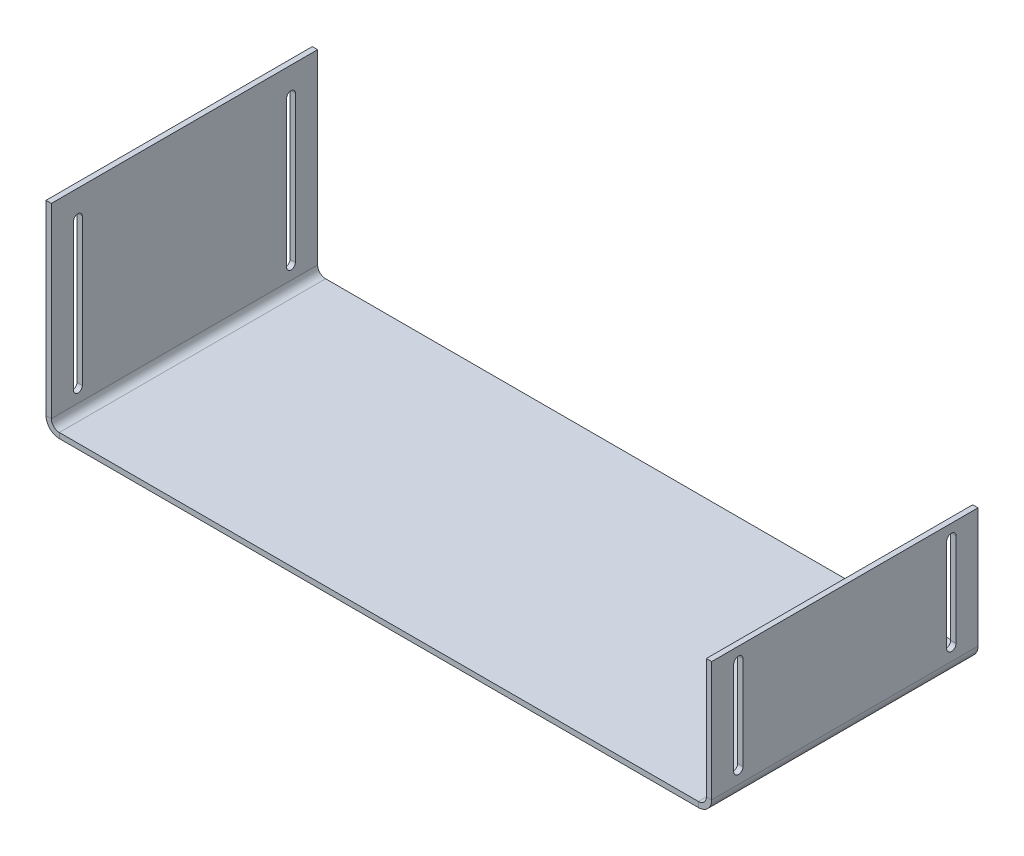
ISO-10303-21;
HEADER;
FILE_DESCRIPTION(('STEP AP214'),'2;1');
FILE_NAME('part.step','',(''),(''),'','','');
FILE_SCHEMA(('AUTOMOTIVE_DESIGN { 1 0 10303 214 1 1 1 1 }'));
ENDSEC;
DATA;
#1=APPLICATION_CONTEXT('core data for automotive mechanical design processes');
#2=APPLICATION_PROTOCOL_DEFINITION('international standard','automotive_design',2000,#1);
#3=PRODUCT_CONTEXT('',#1,'mechanical');
#4=PRODUCT('Part','Part','',(#3));
#5=PRODUCT_RELATED_PRODUCT_CATEGORY('part','',(#4));
#6=PRODUCT_DEFINITION_FORMATION('','',#4);
#7=PRODUCT_DEFINITION_CONTEXT('part definition',#1,'design');
#8=PRODUCT_DEFINITION('design','',#6,#7);
#9=PRODUCT_DEFINITION_SHAPE('','',#8);
#10=(LENGTH_UNIT() NAMED_UNIT(*) SI_UNIT(.MILLI.,.METRE.));
#11=(NAMED_UNIT(*) PLANE_ANGLE_UNIT() SI_UNIT($,.RADIAN.));
#12=(NAMED_UNIT(*) SI_UNIT($,.STERADIAN.) SOLID_ANGLE_UNIT());
#13=UNCERTAINTY_MEASURE_WITH_UNIT(LENGTH_MEASURE(1.E-05),#10,'distance_accuracy_value','');
#14=(GEOMETRIC_REPRESENTATION_CONTEXT(3) GLOBAL_UNCERTAINTY_ASSIGNED_CONTEXT((#13)) GLOBAL_UNIT_ASSIGNED_CONTEXT((#10,
#11,#12)) REPRESENTATION_CONTEXT('',''));
#15=CARTESIAN_POINT('',(0.,0.,0.));
#16=DIRECTION('',(0.,0.,1.));
#17=DIRECTION('',(1.,0.,0.));
#18=AXIS2_PLACEMENT_3D('',#15,#16,#17);
#19=CARTESIAN_POINT('',(0.,-4.,0.));
#20=DIRECTION('',(0.,-1.,0.));
#21=DIRECTION('',(0.,0.,-1.));
#22=AXIS2_PLACEMENT_3D('',#19,#20,#21);
#23=PLANE('',#22);
#24=DIRECTION('',(1.,0.,0.));
#25=VECTOR('',#24,1.);
#26=CARTESIAN_POINT('',(-250.,-4.,100.));
#27=LINE('',#26,#25);
#28=CARTESIAN_POINT('',(-240.,-4.,100.));
#29=VERTEX_POINT('',#28);
#30=CARTESIAN_POINT('',(240.,-4.,100.));
#31=VERTEX_POINT('',#30);
#32=EDGE_CURVE('E11',#29,#31,#27,.T.);
#33=ORIENTED_EDGE('',*,*,#32,.F.);
#34=DIRECTION('',(0.,0.,1.));
#35=VECTOR('',#34,1.);
#36=CARTESIAN_POINT('',(-240.,-4.,100.));
#37=LINE('',#36,#35);
#38=CARTESIAN_POINT('',(-240.,-4.,-100.));
#39=VERTEX_POINT('',#38);
#40=EDGE_CURVE('E358',#29,#39,#37,.F.);
#41=ORIENTED_EDGE('',*,*,#40,.T.);
#42=DIRECTION('',(-1.,0.,0.));
#43=VECTOR('',#42,1.);
#44=CARTESIAN_POINT('',(-250.,-4.,-100.));
#45=LINE('',#44,#43);
#46=CARTESIAN_POINT('',(240.,-4.,-100.));
#47=VERTEX_POINT('',#46);
#48=EDGE_CURVE('E26',#47,#39,#45,.T.);
#49=ORIENTED_EDGE('',*,*,#48,.F.);
#50=DIRECTION('',(0.,0.,-1.));
#51=VECTOR('',#50,1.);
#52=CARTESIAN_POINT('',(240.,-4.,-100.));
#53=LINE('',#52,#51);
#54=EDGE_CURVE('E413',#47,#31,#53,.F.);
#55=ORIENTED_EDGE('',*,*,#54,.T.);
#56=EDGE_LOOP('',(#33,#41,#49,#55));
#57=FACE_BOUND('',#56,.T.);
#58=ADVANCED_FACE('F17',(#57),#23,.T.);
#59=CARTESIAN_POINT('',(0.,0.,0.));
#60=DIRECTION('',(0.,-1.,0.));
#61=DIRECTION('',(0.,0.,-1.));
#62=AXIS2_PLACEMENT_3D('',#59,#60,#61);
#63=PLANE('',#62);
#64=DIRECTION('',(0.,0.,1.));
#65=VECTOR('',#64,1.);
#66=CARTESIAN_POINT('',(-240.,0.,100.));
#67=LINE('',#66,#65);
#68=CARTESIAN_POINT('',(-240.,0.,100.));
#69=VERTEX_POINT('',#68);
#70=CARTESIAN_POINT('',(-240.,0.,-100.));
#71=VERTEX_POINT('',#70);
#72=EDGE_CURVE('E371',#69,#71,#67,.F.);
#73=ORIENTED_EDGE('',*,*,#72,.F.);
#74=DIRECTION('',(1.,0.,0.));
#75=VECTOR('',#74,1.);
#76=CARTESIAN_POINT('',(-250.,0.,100.));
#77=LINE('',#76,#75);
#78=CARTESIAN_POINT('',(240.,0.,100.));
#79=VERTEX_POINT('',#78);
#80=EDGE_CURVE('E437',#69,#79,#77,.T.);
#81=ORIENTED_EDGE('',*,*,#80,.T.);
#82=DIRECTION('',(0.,0.,-1.));
#83=VECTOR('',#82,1.);
#84=CARTESIAN_POINT('',(240.,0.,-100.));
#85=LINE('',#84,#83);
#86=CARTESIAN_POINT('',(240.,0.,-100.));
#87=VERTEX_POINT('',#86);
#88=EDGE_CURVE('E426',#87,#79,#85,.F.);
#89=ORIENTED_EDGE('',*,*,#88,.F.);
#90=DIRECTION('',(-1.,0.,0.));
#91=VECTOR('',#90,1.);
#92=CARTESIAN_POINT('',(-250.,0.,-100.));
#93=LINE('',#92,#91);
#94=EDGE_CURVE('E433',#87,#71,#93,.T.);
#95=ORIENTED_EDGE('',*,*,#94,.T.);
#96=EDGE_LOOP('',(#73,#81,#89,#95));
#97=FACE_BOUND('',#96,.T.);
#98=ADVANCED_FACE('F493',(#97),#63,.F.);
#99=CARTESIAN_POINT('',(-250.,-4.,100.));
#100=DIRECTION('',(0.,0.,1.));
#101=DIRECTION('',(1.,0.,0.));
#102=AXIS2_PLACEMENT_3D('',#99,#100,#101);
#103=PLANE('',#102);
#104=ORIENTED_EDGE('',*,*,#80,.F.);
#105=DIRECTION('',(0.,-1.,0.));
#106=VECTOR('',#105,1.);
#107=CARTESIAN_POINT('',(-240.,0.,100.));
#108=LINE('',#107,#106);
#109=EDGE_CURVE('E365',#69,#29,#108,.T.);
#110=ORIENTED_EDGE('',*,*,#109,.T.);
#111=ORIENTED_EDGE('',*,*,#32,.T.);
#112=DIRECTION('',(0.,-1.,0.));
#113=VECTOR('',#112,1.);
#114=CARTESIAN_POINT('',(240.,0.,100.));
#115=LINE('',#114,#113);
#116=EDGE_CURVE('E430',#79,#31,#115,.T.);
#117=ORIENTED_EDGE('',*,*,#116,.F.);
#118=EDGE_LOOP('',(#104,#110,#111,#117));
#119=FACE_BOUND('',#118,.T.);
#120=ADVANCED_FACE('F497',(#119),#103,.T.);
#121=CARTESIAN_POINT('',(-250.,-4.,-100.));
#122=DIRECTION('',(0.,0.,-1.));
#123=DIRECTION('',(-1.,0.,0.));
#124=AXIS2_PLACEMENT_3D('',#121,#122,#123);
#125=PLANE('',#124);
#126=DIRECTION('',(0.,-1.,0.));
#127=VECTOR('',#126,1.);
#128=CARTESIAN_POINT('',(-240.,0.,-100.));
#129=LINE('',#128,#127);
#130=EDGE_CURVE('E377',#71,#39,#129,.T.);
#131=ORIENTED_EDGE('',*,*,#130,.F.);
#132=ORIENTED_EDGE('',*,*,#94,.F.);
#133=DIRECTION('',(0.,-1.,0.));
#134=VECTOR('',#133,1.);
#135=CARTESIAN_POINT('',(240.,0.,-100.));
#136=LINE('',#135,#134);
#137=EDGE_CURVE('E420',#87,#47,#136,.T.);
#138=ORIENTED_EDGE('',*,*,#137,.T.);
#139=ORIENTED_EDGE('',*,*,#48,.T.);
#140=EDGE_LOOP('',(#131,#132,#138,#139));
#141=FACE_BOUND('',#140,.T.);
#142=ADVANCED_FACE('F482',(#141),#125,.T.);
#143=CARTESIAN_POINT('',(240.,6.,100.));
#144=DIRECTION('',(0.,0.,1.));
#145=DIRECTION('',(1.,0.,0.));
#146=AXIS2_PLACEMENT_3D('',#143,#144,#145);
#147=PLANE('',#146);
#148=DIRECTION('',(-1.,0.,0.));
#149=VECTOR('',#148,1.);
#150=CARTESIAN_POINT('',(250.,6.,100.));
#151=LINE('',#150,#149);
#152=CARTESIAN_POINT('',(246.,6.,100.));
#153=VERTEX_POINT('',#152);
#154=CARTESIAN_POINT('',(250.,6.,100.));
#155=VERTEX_POINT('',#154);
#156=EDGE_CURVE('E380',#153,#155,#151,.F.);
#157=ORIENTED_EDGE('',*,*,#156,.F.);
#158=CARTESIAN_POINT('',(240.,6.,100.));
#159=DIRECTION('',(0.,0.,-1.));
#160=DIRECTION('',(-1.,0.,0.));
#161=AXIS2_PLACEMENT_3D('',#158,#159,#160);
#162=CIRCLE('',#161,6.);
#163=EDGE_CURVE('E423',#79,#153,#162,.F.);
#164=ORIENTED_EDGE('',*,*,#163,.F.);
#165=ORIENTED_EDGE('',*,*,#116,.T.);
#166=CARTESIAN_POINT('',(240.,6.,100.));
#167=DIRECTION('',(0.,0.,-1.));
#168=DIRECTION('',(-1.,0.,0.));
#169=AXIS2_PLACEMENT_3D('',#166,#167,#168);
#170=CIRCLE('',#169,10.);
#171=EDGE_CURVE('E416',#31,#155,#170,.F.);
#172=ORIENTED_EDGE('',*,*,#171,.T.);
#173=EDGE_LOOP('',(#157,#164,#165,#172));
#174=FACE_BOUND('',#173,.T.);
#175=ADVANCED_FACE('F499',(#174),#147,.T.);
#176=CARTESIAN_POINT('',(240.,6.,-100.));
#177=DIRECTION('',(0.,0.,1.));
#178=DIRECTION('',(1.,0.,0.));
#179=AXIS2_PLACEMENT_3D('',#176,#177,#178);
#180=PLANE('',#179);
#181=CARTESIAN_POINT('',(240.,6.,-100.));
#182=DIRECTION('',(0.,0.,-1.));
#183=DIRECTION('',(-1.,0.,0.));
#184=AXIS2_PLACEMENT_3D('',#181,#182,#183);
#185=CIRCLE('',#184,6.);
#186=CARTESIAN_POINT('',(246.,6.,-100.));
#187=VERTEX_POINT('',#186);
#188=EDGE_CURVE('E386',#187,#87,#185,.T.);
#189=ORIENTED_EDGE('',*,*,#188,.F.);
#190=DIRECTION('',(-1.,0.,0.));
#191=VECTOR('',#190,1.);
#192=CARTESIAN_POINT('',(246.,6.,-100.));
#193=LINE('',#192,#191);
#194=CARTESIAN_POINT('',(250.,6.,-100.));
#195=VERTEX_POINT('',#194);
#196=EDGE_CURVE('E406',#187,#195,#193,.F.);
#197=ORIENTED_EDGE('',*,*,#196,.T.);
#198=CARTESIAN_POINT('',(240.,6.,-100.));
#199=DIRECTION('',(0.,0.,-1.));
#200=DIRECTION('',(-1.,0.,0.));
#201=AXIS2_PLACEMENT_3D('',#198,#199,#200);
#202=CIRCLE('',#201,10.);
#203=EDGE_CURVE('E417',#195,#47,#202,.T.);
#204=ORIENTED_EDGE('',*,*,#203,.T.);
#205=ORIENTED_EDGE('',*,*,#137,.F.);
#206=EDGE_LOOP('',(#189,#197,#204,#205));
#207=FACE_BOUND('',#206,.T.);
#208=ADVANCED_FACE('F485',(#207),#180,.F.);
#209=CARTESIAN_POINT('',(240.,6.,-100.));
#210=DIRECTION('',(0.,0.,-1.));
#211=DIRECTION('',(1.,0.,0.));
#212=AXIS2_PLACEMENT_3D('',#209,#210,#211);
#213=CYLINDRICAL_SURFACE('',#212,10.);
#214=ORIENTED_EDGE('',*,*,#54,.F.);
#215=ORIENTED_EDGE('',*,*,#203,.F.);
#216=DIRECTION('',(0.,0.,-1.));
#217=VECTOR('',#216,1.);
#218=CARTESIAN_POINT('',(250.,6.,100.));
#219=LINE('',#218,#217);
#220=EDGE_CURVE('E404',#195,#155,#219,.F.);
#221=ORIENTED_EDGE('',*,*,#220,.T.);
#222=ORIENTED_EDGE('',*,*,#171,.F.);
#223=EDGE_LOOP('',(#214,#215,#221,#222));
#224=FACE_BOUND('',#223,.T.);
#225=ADVANCED_FACE('F520',(#224),#213,.T.);
#226=CARTESIAN_POINT('',(240.,6.,-100.));
#227=DIRECTION('',(0.,0.,-1.));
#228=DIRECTION('',(1.,0.,0.));
#229=AXIS2_PLACEMENT_3D('',#226,#227,#228);
#230=CYLINDRICAL_SURFACE('',#229,6.);
#231=ORIENTED_EDGE('',*,*,#88,.T.);
#232=ORIENTED_EDGE('',*,*,#163,.T.);
#233=DIRECTION('',(0.,0.,-1.));
#234=VECTOR('',#233,1.);
#235=CARTESIAN_POINT('',(246.,6.,100.));
#236=LINE('',#235,#234);
#237=EDGE_CURVE('E409',#153,#187,#236,.T.);
#238=ORIENTED_EDGE('',*,*,#237,.T.);
#239=ORIENTED_EDGE('',*,*,#188,.T.);
#240=EDGE_LOOP('',(#231,#232,#238,#239));
#241=FACE_BOUND('',#240,.T.);
#242=ADVANCED_FACE('F489',(#241),#230,.F.);
#243=CARTESIAN_POINT('',(250.,0.,100.));
#244=DIRECTION('',(0.,0.,-1.));
#245=DIRECTION('',(-1.,0.,0.));
#246=AXIS2_PLACEMENT_3D('',#243,#244,#245);
#247=PLANE('',#246);
#248=ORIENTED_EDGE('',*,*,#156,.T.);
#249=DIRECTION('',(0.,-1.,0.));
#250=VECTOR('',#249,1.);
#251=CARTESIAN_POINT('',(250.,-8.81327663343776E-13,100.));
#252=LINE('',#251,#250);
#253=CARTESIAN_POINT('',(250.,96.,100.));
#254=VERTEX_POINT('',#253);
#255=EDGE_CURVE('E394',#254,#155,#252,.T.);
#256=ORIENTED_EDGE('',*,*,#255,.F.);
#257=DIRECTION('',(-1.,0.,0.));
#258=VECTOR('',#257,1.);
#259=CARTESIAN_POINT('',(250.,96.,100.));
#260=LINE('',#259,#258);
#261=CARTESIAN_POINT('',(246.,96.,100.));
#262=VERTEX_POINT('',#261);
#263=EDGE_CURVE('E387',#254,#262,#260,.T.);
#264=ORIENTED_EDGE('',*,*,#263,.T.);
#265=DIRECTION('',(0.,1.,0.));
#266=VECTOR('',#265,1.);
#267=CARTESIAN_POINT('',(246.,0.,100.));
#268=LINE('',#267,#266);
#269=EDGE_CURVE('E401',#262,#153,#268,.F.);
#270=ORIENTED_EDGE('',*,*,#269,.T.);
#271=EDGE_LOOP('',(#248,#256,#264,#270));
#272=FACE_BOUND('',#271,.T.);
#273=ADVANCED_FACE('F506',(#272),#247,.F.);
#274=CARTESIAN_POINT('',(250.,96.,-100.));
#275=DIRECTION('',(0.,0.,1.));
#276=DIRECTION('',(1.,0.,0.));
#277=AXIS2_PLACEMENT_3D('',#274,#275,#276);
#278=PLANE('',#277);
#279=ORIENTED_EDGE('',*,*,#196,.F.);
#280=DIRECTION('',(0.,-1.,0.));
#281=VECTOR('',#280,1.);
#282=CARTESIAN_POINT('',(246.,96.,-100.));
#283=LINE('',#282,#281);
#284=CARTESIAN_POINT('',(246.,96.,-100.));
#285=VERTEX_POINT('',#284);
#286=EDGE_CURVE('E399',#187,#285,#283,.F.);
#287=ORIENTED_EDGE('',*,*,#286,.T.);
#288=DIRECTION('',(-1.,0.,0.));
#289=VECTOR('',#288,1.);
#290=CARTESIAN_POINT('',(250.,96.,-100.));
#291=LINE('',#290,#289);
#292=CARTESIAN_POINT('',(250.,96.,-100.));
#293=VERTEX_POINT('',#292);
#294=EDGE_CURVE('E383',#293,#285,#291,.T.);
#295=ORIENTED_EDGE('',*,*,#294,.F.);
#296=DIRECTION('',(0.,1.,0.));
#297=VECTOR('',#296,1.);
#298=CARTESIAN_POINT('',(250.,-8.81327663343776E-13,-100.));
#299=LINE('',#298,#297);
#300=EDGE_CURVE('E392',#195,#293,#299,.T.);
#301=ORIENTED_EDGE('',*,*,#300,.F.);
#302=EDGE_LOOP('',(#279,#287,#295,#301));
#303=FACE_BOUND('',#302,.T.);
#304=ADVANCED_FACE('F515',(#303),#278,.F.);
#305=CARTESIAN_POINT('',(250.,-8.81327663343776E-13,0.));
#306=DIRECTION('',(-1.,0.,0.));
#307=DIRECTION('',(0.,-1.,0.));
#308=AXIS2_PLACEMENT_3D('',#305,#306,#307);
#309=PLANE('',#308);
#310=DIRECTION('',(0.,1.,0.));
#311=VECTOR('',#310,1.);
#312=CARTESIAN_POINT('',(250.,86.,-76.5));
#313=LINE('',#312,#311);
#314=CARTESIAN_POINT('',(250.,16.,-76.5));
#315=VERTEX_POINT('',#314);
#316=CARTESIAN_POINT('',(250.,86.,-76.5));
#317=VERTEX_POINT('',#316);
#318=EDGE_CURVE('E283',#315,#317,#313,.T.);
#319=ORIENTED_EDGE('',*,*,#318,.T.);
#320=CARTESIAN_POINT('',(250.,86.,-80.));
#321=DIRECTION('',(-1.,0.,0.));
#322=DIRECTION('',(0.,-1.,0.));
#323=AXIS2_PLACEMENT_3D('',#320,#321,#322);
#324=CIRCLE('',#323,3.5);
#325=CARTESIAN_POINT('',(250.,86.,-83.5));
#326=VERTEX_POINT('',#325);
#327=EDGE_CURVE('E273',#317,#326,#324,.T.);
#328=ORIENTED_EDGE('',*,*,#327,.T.);
#329=DIRECTION('',(0.,-1.,0.));
#330=VECTOR('',#329,1.);
#331=CARTESIAN_POINT('',(250.,86.,-83.5));
#332=LINE('',#331,#330);
#333=CARTESIAN_POINT('',(250.,16.,-83.5));
#334=VERTEX_POINT('',#333);
#335=EDGE_CURVE('E276',#326,#334,#332,.T.);
#336=ORIENTED_EDGE('',*,*,#335,.T.);
#337=CARTESIAN_POINT('',(250.,16.,-80.));
#338=DIRECTION('',(-1.,0.,0.));
#339=DIRECTION('',(0.,-1.,0.));
#340=AXIS2_PLACEMENT_3D('',#337,#338,#339);
#341=CIRCLE('',#340,3.5);
#342=EDGE_CURVE('E280',#334,#315,#341,.T.);
#343=ORIENTED_EDGE('',*,*,#342,.T.);
#344=EDGE_LOOP('',(#319,#328,#336,#343));
#345=FACE_BOUND('',#344,.T.);
#346=DIRECTION('',(0.,1.,0.));
#347=VECTOR('',#346,1.);
#348=CARTESIAN_POINT('',(250.,86.,83.5));
#349=LINE('',#348,#347);
#350=CARTESIAN_POINT('',(250.,16.,83.5));
#351=VERTEX_POINT('',#350);
#352=CARTESIAN_POINT('',(250.,86.,83.5));
#353=VERTEX_POINT('',#352);
#354=EDGE_CURVE('E315',#351,#353,#349,.T.);
#355=ORIENTED_EDGE('',*,*,#354,.T.);
#356=CARTESIAN_POINT('',(250.,86.,80.));
#357=DIRECTION('',(-1.,0.,0.));
#358=DIRECTION('',(0.,-1.,0.));
#359=AXIS2_PLACEMENT_3D('',#356,#357,#358);
#360=CIRCLE('',#359,3.49999999999996);
#361=CARTESIAN_POINT('',(250.,86.,76.5));
#362=VERTEX_POINT('',#361);
#363=EDGE_CURVE('E305',#353,#362,#360,.T.);
#364=ORIENTED_EDGE('',*,*,#363,.T.);
#365=DIRECTION('',(0.,-1.,0.));
#366=VECTOR('',#365,1.);
#367=CARTESIAN_POINT('',(250.,86.,76.5));
#368=LINE('',#367,#366);
#369=CARTESIAN_POINT('',(250.,16.,76.5));
#370=VERTEX_POINT('',#369);
#371=EDGE_CURVE('E308',#362,#370,#368,.T.);
#372=ORIENTED_EDGE('',*,*,#371,.T.);
#373=CARTESIAN_POINT('',(250.,16.,80.));
#374=DIRECTION('',(-1.,0.,0.));
#375=DIRECTION('',(0.,-1.,0.));
#376=AXIS2_PLACEMENT_3D('',#373,#374,#375);
#377=CIRCLE('',#376,3.5);
#378=EDGE_CURVE('E312',#370,#351,#377,.T.);
#379=ORIENTED_EDGE('',*,*,#378,.T.);
#380=EDGE_LOOP('',(#355,#364,#372,#379));
#381=FACE_BOUND('',#380,.T.);
#382=ORIENTED_EDGE('',*,*,#220,.F.);
#383=ORIENTED_EDGE('',*,*,#300,.T.);
#384=DIRECTION('',(0.,0.,1.));
#385=VECTOR('',#384,1.);
#386=CARTESIAN_POINT('',(250.,96.,0.));
#387=LINE('',#386,#385);
#388=EDGE_CURVE('E390',#293,#254,#387,.T.);
#389=ORIENTED_EDGE('',*,*,#388,.T.);
#390=ORIENTED_EDGE('',*,*,#255,.T.);
#391=EDGE_LOOP('',(#382,#383,#389,#390));
#392=FACE_BOUND('',#391,.T.);
#393=ADVANCED_FACE('F518',(#345,#381,#392),#309,.F.);
#394=CARTESIAN_POINT('',(246.,-8.67361737988404E-13,0.));
#395=DIRECTION('',(-1.,0.,0.));
#396=DIRECTION('',(0.,-1.,0.));
#397=AXIS2_PLACEMENT_3D('',#394,#395,#396);
#398=PLANE('',#397);
#399=CARTESIAN_POINT('',(246.,86.,-80.));
#400=DIRECTION('',(-1.,0.,0.));
#401=DIRECTION('',(0.,-1.,0.));
#402=AXIS2_PLACEMENT_3D('',#399,#400,#401);
#403=CIRCLE('',#402,3.5);
#404=CARTESIAN_POINT('',(246.,86.,-76.5));
#405=VERTEX_POINT('',#404);
#406=CARTESIAN_POINT('',(246.,86.,-83.5));
#407=VERTEX_POINT('',#406);
#408=EDGE_CURVE('E266',#405,#407,#403,.T.);
#409=ORIENTED_EDGE('',*,*,#408,.F.);
#410=DIRECTION('',(0.,1.,0.));
#411=VECTOR('',#410,1.);
#412=CARTESIAN_POINT('',(246.,86.,-76.5));
#413=LINE('',#412,#411);
#414=CARTESIAN_POINT('',(246.,16.,-76.5));
#415=VERTEX_POINT('',#414);
#416=EDGE_CURVE('E277',#415,#405,#413,.T.);
#417=ORIENTED_EDGE('',*,*,#416,.F.);
#418=CARTESIAN_POINT('',(246.,16.,-80.));
#419=DIRECTION('',(-1.,0.,0.));
#420=DIRECTION('',(0.,-1.,0.));
#421=AXIS2_PLACEMENT_3D('',#418,#419,#420);
#422=CIRCLE('',#421,3.5);
#423=CARTESIAN_POINT('',(246.,16.,-83.5));
#424=VERTEX_POINT('',#423);
#425=EDGE_CURVE('E291',#424,#415,#422,.T.);
#426=ORIENTED_EDGE('',*,*,#425,.F.);
#427=DIRECTION('',(0.,-1.,0.));
#428=VECTOR('',#427,1.);
#429=CARTESIAN_POINT('',(246.,86.,-83.5));
#430=LINE('',#429,#428);
#431=EDGE_CURVE('E288',#407,#424,#430,.T.);
#432=ORIENTED_EDGE('',*,*,#431,.F.);
#433=EDGE_LOOP('',(#409,#417,#426,#432));
#434=FACE_BOUND('',#433,.T.);
#435=CARTESIAN_POINT('',(246.,86.,80.));
#436=DIRECTION('',(-1.,0.,0.));
#437=DIRECTION('',(0.,-1.,0.));
#438=AXIS2_PLACEMENT_3D('',#435,#436,#437);
#439=CIRCLE('',#438,3.49999999999996);
#440=CARTESIAN_POINT('',(246.,86.,83.5));
#441=VERTEX_POINT('',#440);
#442=CARTESIAN_POINT('',(246.,86.,76.5));
#443=VERTEX_POINT('',#442);
#444=EDGE_CURVE('E298',#441,#443,#439,.T.);
#445=ORIENTED_EDGE('',*,*,#444,.F.);
#446=DIRECTION('',(0.,1.,0.));
#447=VECTOR('',#446,1.);
#448=CARTESIAN_POINT('',(246.,86.,83.5));
#449=LINE('',#448,#447);
#450=CARTESIAN_POINT('',(246.,16.,83.5));
#451=VERTEX_POINT('',#450);
#452=EDGE_CURVE('E309',#451,#441,#449,.T.);
#453=ORIENTED_EDGE('',*,*,#452,.F.);
#454=CARTESIAN_POINT('',(246.,16.,80.));
#455=DIRECTION('',(-1.,0.,0.));
#456=DIRECTION('',(0.,-1.,0.));
#457=AXIS2_PLACEMENT_3D('',#454,#455,#456);
#458=CIRCLE('',#457,3.5);
#459=CARTESIAN_POINT('',(246.,16.,76.5));
#460=VERTEX_POINT('',#459);
#461=EDGE_CURVE('E323',#460,#451,#458,.T.);
#462=ORIENTED_EDGE('',*,*,#461,.F.);
#463=DIRECTION('',(0.,-1.,0.));
#464=VECTOR('',#463,1.);
#465=CARTESIAN_POINT('',(246.,86.,76.5));
#466=LINE('',#465,#464);
#467=EDGE_CURVE('E320',#443,#460,#466,.T.);
#468=ORIENTED_EDGE('',*,*,#467,.F.);
#469=EDGE_LOOP('',(#445,#453,#462,#468));
#470=FACE_BOUND('',#469,.T.);
#471=ORIENTED_EDGE('',*,*,#286,.F.);
#472=ORIENTED_EDGE('',*,*,#237,.F.);
#473=ORIENTED_EDGE('',*,*,#269,.F.);
#474=DIRECTION('',(0.,0.,-1.));
#475=VECTOR('',#474,1.);
#476=CARTESIAN_POINT('',(246.,96.,100.));
#477=LINE('',#476,#475);
#478=EDGE_CURVE('E397',#285,#262,#477,.F.);
#479=ORIENTED_EDGE('',*,*,#478,.F.);
#480=EDGE_LOOP('',(#471,#472,#473,#479));
#481=FACE_BOUND('',#480,.T.);
#482=ADVANCED_FACE('F503',(#434,#470,#481),#398,.T.);
#483=CARTESIAN_POINT('',(250.,96.,100.));
#484=DIRECTION('',(0.,-1.,0.));
#485=DIRECTION('',(1.,0.,0.));
#486=AXIS2_PLACEMENT_3D('',#483,#484,#485);
#487=PLANE('',#486);
#488=ORIENTED_EDGE('',*,*,#478,.T.);
#489=ORIENTED_EDGE('',*,*,#263,.F.);
#490=ORIENTED_EDGE('',*,*,#388,.F.);
#491=ORIENTED_EDGE('',*,*,#294,.T.);
#492=EDGE_LOOP('',(#488,#489,#490,#491));
#493=FACE_BOUND('',#492,.T.);
#494=ADVANCED_FACE('F511',(#493),#487,.F.);
#495=CARTESIAN_POINT('',(-240.,6.,-100.));
#496=DIRECTION('',(0.,0.,-1.));
#497=DIRECTION('',(-1.,0.,0.));
#498=AXIS2_PLACEMENT_3D('',#495,#496,#497);
#499=PLANE('',#498);
#500=DIRECTION('',(1.,0.,0.));
#501=VECTOR('',#500,1.);
#502=CARTESIAN_POINT('',(-250.,6.,-100.));
#503=LINE('',#502,#501);
#504=CARTESIAN_POINT('',(-246.,6.,-100.));
#505=VERTEX_POINT('',#504);
#506=CARTESIAN_POINT('',(-250.,6.,-100.));
#507=VERTEX_POINT('',#506);
#508=EDGE_CURVE('E330',#505,#507,#503,.F.);
#509=ORIENTED_EDGE('',*,*,#508,.F.);
#510=CARTESIAN_POINT('',(-240.,6.,-100.));
#511=DIRECTION('',(0.,0.,1.));
#512=DIRECTION('',(1.,0.,0.));
#513=AXIS2_PLACEMENT_3D('',#510,#511,#512);
#514=CIRCLE('',#513,6.);
#515=EDGE_CURVE('E368',#71,#505,#514,.F.);
#516=ORIENTED_EDGE('',*,*,#515,.F.);
#517=ORIENTED_EDGE('',*,*,#130,.T.);
#518=CARTESIAN_POINT('',(-240.,6.,-100.));
#519=DIRECTION('',(0.,0.,1.));
#520=DIRECTION('',(1.,0.,0.));
#521=AXIS2_PLACEMENT_3D('',#518,#519,#520);
#522=CIRCLE('',#521,10.);
#523=EDGE_CURVE('E361',#39,#507,#522,.F.);
#524=ORIENTED_EDGE('',*,*,#523,.T.);
#525=EDGE_LOOP('',(#509,#516,#517,#524));
#526=FACE_BOUND('',#525,.T.);
#527=ADVANCED_FACE('F475',(#526),#499,.T.);
#528=CARTESIAN_POINT('',(-240.,6.,100.));
#529=DIRECTION('',(0.,0.,-1.));
#530=DIRECTION('',(-1.,0.,0.));
#531=AXIS2_PLACEMENT_3D('',#528,#529,#530);
#532=PLANE('',#531);
#533=CARTESIAN_POINT('',(-240.,6.,100.));
#534=DIRECTION('',(0.,0.,1.));
#535=DIRECTION('',(1.,0.,0.));
#536=AXIS2_PLACEMENT_3D('',#533,#534,#535);
#537=CIRCLE('',#536,6.);
#538=CARTESIAN_POINT('',(-246.,6.,100.));
#539=VERTEX_POINT('',#538);
#540=EDGE_CURVE('E373',#539,#69,#537,.T.);
#541=ORIENTED_EDGE('',*,*,#540,.F.);
#542=DIRECTION('',(1.,0.,0.));
#543=VECTOR('',#542,1.);
#544=CARTESIAN_POINT('',(-246.,6.,100.));
#545=LINE('',#544,#543);
#546=CARTESIAN_POINT('',(-250.,6.,100.));
#547=VERTEX_POINT('',#546);
#548=EDGE_CURVE('E351',#539,#547,#545,.F.);
#549=ORIENTED_EDGE('',*,*,#548,.T.);
#550=CARTESIAN_POINT('',(-240.,6.,100.));
#551=DIRECTION('',(0.,0.,1.));
#552=DIRECTION('',(1.,0.,0.));
#553=AXIS2_PLACEMENT_3D('',#550,#551,#552);
#554=CIRCLE('',#553,10.);
#555=EDGE_CURVE('E362',#547,#29,#554,.T.);
#556=ORIENTED_EDGE('',*,*,#555,.T.);
#557=ORIENTED_EDGE('',*,*,#109,.F.);
#558=EDGE_LOOP('',(#541,#549,#556,#557));
#559=FACE_BOUND('',#558,.T.);
#560=ADVANCED_FACE('F466',(#559),#532,.F.);
#561=CARTESIAN_POINT('',(-240.,6.,100.));
#562=DIRECTION('',(0.,0.,1.));
#563=DIRECTION('',(-1.,0.,0.));
#564=AXIS2_PLACEMENT_3D('',#561,#562,#563);
#565=CYLINDRICAL_SURFACE('',#564,10.);
#566=ORIENTED_EDGE('',*,*,#40,.F.);
#567=ORIENTED_EDGE('',*,*,#555,.F.);
#568=DIRECTION('',(0.,0.,1.));
#569=VECTOR('',#568,1.);
#570=CARTESIAN_POINT('',(-250.,6.,-100.));
#571=LINE('',#570,#569);
#572=EDGE_CURVE('E349',#547,#507,#571,.F.);
#573=ORIENTED_EDGE('',*,*,#572,.T.);
#574=ORIENTED_EDGE('',*,*,#523,.F.);
#575=EDGE_LOOP('',(#566,#567,#573,#574));
#576=FACE_BOUND('',#575,.T.);
#577=ADVANCED_FACE('F473',(#576),#565,.T.);
#578=CARTESIAN_POINT('',(-240.,6.,100.));
#579=DIRECTION('',(0.,0.,1.));
#580=DIRECTION('',(-1.,0.,0.));
#581=AXIS2_PLACEMENT_3D('',#578,#579,#580);
#582=CYLINDRICAL_SURFACE('',#581,6.);
#583=ORIENTED_EDGE('',*,*,#72,.T.);
#584=ORIENTED_EDGE('',*,*,#515,.T.);
#585=DIRECTION('',(0.,0.,1.));
#586=VECTOR('',#585,1.);
#587=CARTESIAN_POINT('',(-246.,6.,-100.));
#588=LINE('',#587,#586);
#589=EDGE_CURVE('E354',#505,#539,#588,.T.);
#590=ORIENTED_EDGE('',*,*,#589,.T.);
#591=ORIENTED_EDGE('',*,*,#540,.T.);
#592=EDGE_LOOP('',(#583,#584,#590,#591));
#593=FACE_BOUND('',#592,.T.);
#594=ADVANCED_FACE('F461',(#593),#582,.F.);
#595=CARTESIAN_POINT('',(-250.,0.,-100.));
#596=DIRECTION('',(0.,0.,1.));
#597=DIRECTION('',(1.,0.,0.));
#598=AXIS2_PLACEMENT_3D('',#595,#596,#597);
#599=PLANE('',#598);
#600=ORIENTED_EDGE('',*,*,#508,.T.);
#601=DIRECTION('',(0.,-1.,0.));
#602=VECTOR('',#601,1.);
#603=CARTESIAN_POINT('',(-250.,-8.81327663343776E-13,-100.));
#604=LINE('',#603,#602);
#605=CARTESIAN_POINT('',(-250.,146.,-100.));
#606=VERTEX_POINT('',#605);
#607=EDGE_CURVE('E340',#606,#507,#604,.T.);
#608=ORIENTED_EDGE('',*,*,#607,.F.);
#609=DIRECTION('',(1.,0.,0.));
#610=VECTOR('',#609,1.);
#611=CARTESIAN_POINT('',(-250.,146.,-100.));
#612=LINE('',#611,#610);
#613=CARTESIAN_POINT('',(-246.,146.,-100.));
#614=VERTEX_POINT('',#613);
#615=EDGE_CURVE('E21',#606,#614,#612,.T.);
#616=ORIENTED_EDGE('',*,*,#615,.T.);
#617=DIRECTION('',(0.,1.,0.));
#618=VECTOR('',#617,1.);
#619=CARTESIAN_POINT('',(-246.,0.,-100.));
#620=LINE('',#619,#618);
#621=EDGE_CURVE('E346',#614,#505,#620,.F.);
#622=ORIENTED_EDGE('',*,*,#621,.T.);
#623=EDGE_LOOP('',(#600,#608,#616,#622));
#624=FACE_BOUND('',#623,.T.);
#625=ADVANCED_FACE('F452',(#624),#599,.F.);
#626=CARTESIAN_POINT('',(-250.,96.,100.));
#627=DIRECTION('',(0.,0.,-1.));
#628=DIRECTION('',(-1.,0.,0.));
#629=AXIS2_PLACEMENT_3D('',#626,#627,#628);
#630=PLANE('',#629);
#631=ORIENTED_EDGE('',*,*,#548,.F.);
#632=DIRECTION('',(0.,-1.,0.));
#633=VECTOR('',#632,1.);
#634=CARTESIAN_POINT('',(-246.,96.,100.));
#635=LINE('',#634,#633);
#636=CARTESIAN_POINT('',(-246.,146.,100.));
#637=VERTEX_POINT('',#636);
#638=EDGE_CURVE('E344',#539,#637,#635,.F.);
#639=ORIENTED_EDGE('',*,*,#638,.T.);
#640=DIRECTION('',(1.,0.,0.));
#641=VECTOR('',#640,1.);
#642=CARTESIAN_POINT('',(-250.,146.,100.));
#643=LINE('',#642,#641);
#644=CARTESIAN_POINT('',(-250.,146.,100.));
#645=VERTEX_POINT('',#644);
#646=EDGE_CURVE('E376',#645,#637,#643,.T.);
#647=ORIENTED_EDGE('',*,*,#646,.F.);
#648=DIRECTION('',(0.,1.,0.));
#649=VECTOR('',#648,1.);
#650=CARTESIAN_POINT('',(-250.,-8.81327663343776E-13,100.));
#651=LINE('',#650,#649);
#652=EDGE_CURVE('E337',#547,#645,#651,.T.);
#653=ORIENTED_EDGE('',*,*,#652,.F.);
#654=EDGE_LOOP('',(#631,#639,#647,#653));
#655=FACE_BOUND('',#654,.T.);
#656=ADVANCED_FACE('F470',(#655),#630,.F.);
#657=CARTESIAN_POINT('',(-250.,-8.81327663343776E-13,0.));
#658=DIRECTION('',(1.,0.,0.));
#659=DIRECTION('',(0.,1.,0.));
#660=AXIS2_PLACEMENT_3D('',#657,#658,#659);
#661=PLANE('',#660);
#662=DIRECTION('',(0.,1.,0.));
#663=VECTOR('',#662,1.);
#664=CARTESIAN_POINT('',(-250.,126.,-83.3));
#665=LINE('',#664,#663);
#666=CARTESIAN_POINT('',(-250.,16.,-83.3));
#667=VERTEX_POINT('',#666);
#668=CARTESIAN_POINT('',(-250.,126.,-83.3));
#669=VERTEX_POINT('',#668);
#670=EDGE_CURVE('E212',#667,#669,#665,.T.);
#671=ORIENTED_EDGE('',*,*,#670,.T.);
#672=CARTESIAN_POINT('',(-250.,126.,-80.));
#673=DIRECTION('',(1.,0.,0.));
#674=DIRECTION('',(0.,1.,0.));
#675=AXIS2_PLACEMENT_3D('',#672,#673,#674);
#676=CIRCLE('',#675,3.3);
#677=CARTESIAN_POINT('',(-250.,126.,-76.7));
#678=VERTEX_POINT('',#677);
#679=EDGE_CURVE('E206',#669,#678,#676,.T.);
#680=ORIENTED_EDGE('',*,*,#679,.T.);
#681=DIRECTION('',(0.,-1.,0.));
#682=VECTOR('',#681,1.);
#683=CARTESIAN_POINT('',(-250.,126.,-76.7));
#684=LINE('',#683,#682);
#685=CARTESIAN_POINT('',(-250.,16.,-76.7));
#686=VERTEX_POINT('',#685);
#687=EDGE_CURVE('E215',#678,#686,#684,.T.);
#688=ORIENTED_EDGE('',*,*,#687,.T.);
#689=CARTESIAN_POINT('',(-250.,16.,-80.));
#690=DIRECTION('',(1.,0.,0.));
#691=DIRECTION('',(0.,1.,0.));
#692=AXIS2_PLACEMENT_3D('',#689,#690,#691);
#693=CIRCLE('',#692,3.3);
#694=EDGE_CURVE('E34',#686,#667,#693,.T.);
#695=ORIENTED_EDGE('',*,*,#694,.T.);
#696=EDGE_LOOP('',(#671,#680,#688,#695));
#697=FACE_BOUND('',#696,.T.);
#698=DIRECTION('',(0.,1.,0.));
#699=VECTOR('',#698,1.);
#700=CARTESIAN_POINT('',(-250.,126.,76.7));
#701=LINE('',#700,#699);
#702=CARTESIAN_POINT('',(-250.,16.,76.7));
#703=VERTEX_POINT('',#702);
#704=CARTESIAN_POINT('',(-250.,126.,76.7));
#705=VERTEX_POINT('',#704);
#706=EDGE_CURVE('E251',#703,#705,#701,.T.);
#707=ORIENTED_EDGE('',*,*,#706,.T.);
#708=CARTESIAN_POINT('',(-250.,126.,80.));
#709=DIRECTION('',(1.,0.,0.));
#710=DIRECTION('',(0.,1.,0.));
#711=AXIS2_PLACEMENT_3D('',#708,#709,#710);
#712=CIRCLE('',#711,3.3);
#713=CARTESIAN_POINT('',(-250.,126.,83.3));
#714=VERTEX_POINT('',#713);
#715=EDGE_CURVE('E241',#705,#714,#712,.T.);
#716=ORIENTED_EDGE('',*,*,#715,.T.);
#717=DIRECTION('',(0.,-1.,0.));
#718=VECTOR('',#717,1.);
#719=CARTESIAN_POINT('',(-250.,126.,83.3));
#720=LINE('',#719,#718);
#721=CARTESIAN_POINT('',(-250.,16.,83.3));
#722=VERTEX_POINT('',#721);
#723=EDGE_CURVE('E244',#714,#722,#720,.T.);
#724=ORIENTED_EDGE('',*,*,#723,.T.);
#725=CARTESIAN_POINT('',(-250.,16.,80.));
#726=DIRECTION('',(1.,0.,0.));
#727=DIRECTION('',(0.,1.,0.));
#728=AXIS2_PLACEMENT_3D('',#725,#726,#727);
#729=CIRCLE('',#728,3.3);
#730=EDGE_CURVE('E248',#722,#703,#729,.T.);
#731=ORIENTED_EDGE('',*,*,#730,.T.);
#732=EDGE_LOOP('',(#707,#716,#724,#731));
#733=FACE_BOUND('',#732,.T.);
#734=ORIENTED_EDGE('',*,*,#572,.F.);
#735=ORIENTED_EDGE('',*,*,#652,.T.);
#736=DIRECTION('',(0.,0.,-1.));
#737=VECTOR('',#736,1.);
#738=CARTESIAN_POINT('',(-250.,146.,0.));
#739=LINE('',#738,#737);
#740=EDGE_CURVE('E339',#645,#606,#739,.T.);
#741=ORIENTED_EDGE('',*,*,#740,.T.);
#742=ORIENTED_EDGE('',*,*,#607,.T.);
#743=EDGE_LOOP('',(#734,#735,#741,#742));
#744=FACE_BOUND('',#743,.T.);
#745=ADVANCED_FACE('F219',(#697,#733,#744),#661,.F.);
#746=CARTESIAN_POINT('',(-246.,-8.67361737988403E-13,0.));
#747=DIRECTION('',(1.,0.,0.));
#748=DIRECTION('',(0.,1.,0.));
#749=AXIS2_PLACEMENT_3D('',#746,#747,#748);
#750=PLANE('',#749);
#751=CARTESIAN_POINT('',(-246.,126.,-80.));
#752=DIRECTION('',(1.,0.,0.));
#753=DIRECTION('',(0.,1.,0.));
#754=AXIS2_PLACEMENT_3D('',#751,#752,#753);
#755=CIRCLE('',#754,3.3);
#756=CARTESIAN_POINT('',(-246.,126.,-83.3));
#757=VERTEX_POINT('',#756);
#758=CARTESIAN_POINT('',(-246.,126.,-76.7));
#759=VERTEX_POINT('',#758);
#760=EDGE_CURVE('E42',#757,#759,#755,.T.);
#761=ORIENTED_EDGE('',*,*,#760,.F.);
#762=DIRECTION('',(0.,1.,0.));
#763=VECTOR('',#762,1.);
#764=CARTESIAN_POINT('',(-246.,126.,-83.3));
#765=LINE('',#764,#763);
#766=CARTESIAN_POINT('',(-246.,16.,-83.3));
#767=VERTEX_POINT('',#766);
#768=EDGE_CURVE('E222',#767,#757,#765,.T.);
#769=ORIENTED_EDGE('',*,*,#768,.F.);
#770=CARTESIAN_POINT('',(-246.,16.,-80.));
#771=DIRECTION('',(1.,0.,0.));
#772=DIRECTION('',(0.,1.,0.));
#773=AXIS2_PLACEMENT_3D('',#770,#771,#772);
#774=CIRCLE('',#773,3.3);
#775=CARTESIAN_POINT('',(-246.,16.,-76.7));
#776=VERTEX_POINT('',#775);
#777=EDGE_CURVE('E225',#776,#767,#774,.T.);
#778=ORIENTED_EDGE('',*,*,#777,.F.);
#779=DIRECTION('',(0.,-1.,0.));
#780=VECTOR('',#779,1.);
#781=CARTESIAN_POINT('',(-246.,126.,-76.7));
#782=LINE('',#781,#780);
#783=EDGE_CURVE('E231',#759,#776,#782,.T.);
#784=ORIENTED_EDGE('',*,*,#783,.F.);
#785=EDGE_LOOP('',(#761,#769,#778,#784));
#786=FACE_BOUND('',#785,.T.);
#787=CARTESIAN_POINT('',(-246.,126.,80.));
#788=DIRECTION('',(1.,0.,0.));
#789=DIRECTION('',(0.,1.,0.));
#790=AXIS2_PLACEMENT_3D('',#787,#788,#789);
#791=CIRCLE('',#790,3.3);
#792=CARTESIAN_POINT('',(-246.,126.,76.7));
#793=VERTEX_POINT('',#792);
#794=CARTESIAN_POINT('',(-246.,126.,83.3));
#795=VERTEX_POINT('',#794);
#796=EDGE_CURVE('E237',#793,#795,#791,.T.);
#797=ORIENTED_EDGE('',*,*,#796,.F.);
#798=DIRECTION('',(0.,1.,0.));
#799=VECTOR('',#798,1.);
#800=CARTESIAN_POINT('',(-246.,126.,76.7));
#801=LINE('',#800,#799);
#802=CARTESIAN_POINT('',(-246.,16.,76.7));
#803=VERTEX_POINT('',#802);
#804=EDGE_CURVE('E245',#803,#793,#801,.T.);
#805=ORIENTED_EDGE('',*,*,#804,.F.);
#806=CARTESIAN_POINT('',(-246.,16.,80.));
#807=DIRECTION('',(1.,0.,0.));
#808=DIRECTION('',(0.,1.,0.));
#809=AXIS2_PLACEMENT_3D('',#806,#807,#808);
#810=CIRCLE('',#809,3.3);
#811=CARTESIAN_POINT('',(-246.,16.,83.3));
#812=VERTEX_POINT('',#811);
#813=EDGE_CURVE('E259',#812,#803,#810,.T.);
#814=ORIENTED_EDGE('',*,*,#813,.F.);
#815=DIRECTION('',(0.,-1.,0.));
#816=VECTOR('',#815,1.);
#817=CARTESIAN_POINT('',(-246.,126.,83.3));
#818=LINE('',#817,#816);
#819=EDGE_CURVE('E256',#795,#812,#818,.T.);
#820=ORIENTED_EDGE('',*,*,#819,.F.);
#821=EDGE_LOOP('',(#797,#805,#814,#820));
#822=FACE_BOUND('',#821,.T.);
#823=ORIENTED_EDGE('',*,*,#638,.F.);
#824=ORIENTED_EDGE('',*,*,#589,.F.);
#825=ORIENTED_EDGE('',*,*,#621,.F.);
#826=DIRECTION('',(0.,0.,-1.));
#827=VECTOR('',#826,1.);
#828=CARTESIAN_POINT('',(-246.,146.,0.));
#829=LINE('',#828,#827);
#830=EDGE_CURVE('E343',#637,#614,#829,.T.);
#831=ORIENTED_EDGE('',*,*,#830,.F.);
#832=EDGE_LOOP('',(#823,#824,#825,#831));
#833=FACE_BOUND('',#832,.T.);
#834=ADVANCED_FACE('F458',(#786,#822,#833),#750,.T.);
#835=CARTESIAN_POINT('',(-250.,146.,-100.));
#836=DIRECTION('',(0.,-1.,0.));
#837=DIRECTION('',(1.,0.,0.));
#838=AXIS2_PLACEMENT_3D('',#835,#836,#837);
#839=PLANE('',#838);
#840=ORIENTED_EDGE('',*,*,#830,.T.);
#841=ORIENTED_EDGE('',*,*,#615,.F.);
#842=ORIENTED_EDGE('',*,*,#740,.F.);
#843=ORIENTED_EDGE('',*,*,#646,.T.);
#844=EDGE_LOOP('',(#840,#841,#842,#843));
#845=FACE_BOUND('',#844,.T.);
#846=ADVANCED_FACE('F19',(#845),#839,.F.);
#847=CARTESIAN_POINT('',(250.,86.,80.));
#848=DIRECTION('',(-1.,0.,0.));
#849=DIRECTION('',(0.,-1.,0.));
#850=AXIS2_PLACEMENT_3D('',#847,#848,#849);
#851=CYLINDRICAL_SURFACE('',#850,3.49999999999996);
#852=ORIENTED_EDGE('',*,*,#444,.T.);
#853=DIRECTION('',(-1.,0.,0.));
#854=VECTOR('',#853,1.);
#855=CARTESIAN_POINT('',(250.,86.,76.5));
#856=LINE('',#855,#854);
#857=EDGE_CURVE('E318',#362,#443,#856,.T.);
#858=ORIENTED_EDGE('',*,*,#857,.F.);
#859=ORIENTED_EDGE('',*,*,#363,.F.);
#860=DIRECTION('',(-1.,0.,0.));
#861=VECTOR('',#860,1.);
#862=CARTESIAN_POINT('',(250.,86.,83.5));
#863=LINE('',#862,#861);
#864=EDGE_CURVE('E328',#353,#441,#863,.T.);
#865=ORIENTED_EDGE('',*,*,#864,.T.);
#866=EDGE_LOOP('',(#852,#858,#859,#865));
#867=FACE_BOUND('',#866,.T.);
#868=ADVANCED_FACE('F684',(#867),#851,.F.);
#869=CARTESIAN_POINT('',(250.,86.,83.5));
#870=DIRECTION('',(0.,0.,1.));
#871=DIRECTION('',(0.,-1.,0.));
#872=AXIS2_PLACEMENT_3D('',#869,#870,#871);
#873=PLANE('',#872);
#874=ORIENTED_EDGE('',*,*,#452,.T.);
#875=ORIENTED_EDGE('',*,*,#864,.F.);
#876=ORIENTED_EDGE('',*,*,#354,.F.);
#877=DIRECTION('',(-1.,0.,0.));
#878=VECTOR('',#877,1.);
#879=CARTESIAN_POINT('',(250.,16.,83.5));
#880=LINE('',#879,#878);
#881=EDGE_CURVE('E331',#351,#451,#880,.T.);
#882=ORIENTED_EDGE('',*,*,#881,.T.);
#883=EDGE_LOOP('',(#874,#875,#876,#882));
#884=FACE_BOUND('',#883,.T.);
#885=ADVANCED_FACE('F692',(#884),#873,.F.);
#886=CARTESIAN_POINT('',(250.,16.,80.));
#887=DIRECTION('',(-1.,0.,0.));
#888=DIRECTION('',(0.,-1.,0.));
#889=AXIS2_PLACEMENT_3D('',#886,#887,#888);
#890=CYLINDRICAL_SURFACE('',#889,3.5);
#891=ORIENTED_EDGE('',*,*,#461,.T.);
#892=ORIENTED_EDGE('',*,*,#881,.F.);
#893=ORIENTED_EDGE('',*,*,#378,.F.);
#894=DIRECTION('',(-1.,0.,0.));
#895=VECTOR('',#894,1.);
#896=CARTESIAN_POINT('',(250.,16.,76.5));
#897=LINE('',#896,#895);
#898=EDGE_CURVE('E333',#370,#460,#897,.T.);
#899=ORIENTED_EDGE('',*,*,#898,.T.);
#900=EDGE_LOOP('',(#891,#892,#893,#899));
#901=FACE_BOUND('',#900,.T.);
#902=ADVANCED_FACE('F702',(#901),#890,.F.);
#903=CARTESIAN_POINT('',(250.,86.,76.5));
#904=DIRECTION('',(0.,0.,-1.));
#905=DIRECTION('',(0.,1.,0.));
#906=AXIS2_PLACEMENT_3D('',#903,#904,#905);
#907=PLANE('',#906);
#908=ORIENTED_EDGE('',*,*,#467,.T.);
#909=ORIENTED_EDGE('',*,*,#898,.F.);
#910=ORIENTED_EDGE('',*,*,#371,.F.);
#911=ORIENTED_EDGE('',*,*,#857,.T.);
#912=EDGE_LOOP('',(#908,#909,#910,#911));
#913=FACE_BOUND('',#912,.T.);
#914=ADVANCED_FACE('F712',(#913),#907,.F.);
#915=CARTESIAN_POINT('',(250.,86.,-80.));
#916=DIRECTION('',(-1.,0.,0.));
#917=DIRECTION('',(0.,-1.,0.));
#918=AXIS2_PLACEMENT_3D('',#915,#916,#917);
#919=CYLINDRICAL_SURFACE('',#918,3.5);
#920=ORIENTED_EDGE('',*,*,#408,.T.);
#921=DIRECTION('',(-1.,0.,0.));
#922=VECTOR('',#921,1.);
#923=CARTESIAN_POINT('',(250.,86.,-83.5));
#924=LINE('',#923,#922);
#925=EDGE_CURVE('E286',#326,#407,#924,.T.);
#926=ORIENTED_EDGE('',*,*,#925,.F.);
#927=ORIENTED_EDGE('',*,*,#327,.F.);
#928=DIRECTION('',(-1.,0.,0.));
#929=VECTOR('',#928,1.);
#930=CARTESIAN_POINT('',(250.,86.,-76.5));
#931=LINE('',#930,#929);
#932=EDGE_CURVE('E296',#317,#405,#931,.T.);
#933=ORIENTED_EDGE('',*,*,#932,.T.);
#934=EDGE_LOOP('',(#920,#926,#927,#933));
#935=FACE_BOUND('',#934,.T.);
#936=ADVANCED_FACE('F722',(#935),#919,.F.);
#937=CARTESIAN_POINT('',(250.,86.,-76.5));
#938=DIRECTION('',(0.,0.,1.));
#939=DIRECTION('',(0.,-1.,0.));
#940=AXIS2_PLACEMENT_3D('',#937,#938,#939);
#941=PLANE('',#940);
#942=ORIENTED_EDGE('',*,*,#416,.T.);
#943=ORIENTED_EDGE('',*,*,#932,.F.);
#944=ORIENTED_EDGE('',*,*,#318,.F.);
#945=DIRECTION('',(-1.,0.,0.));
#946=VECTOR('',#945,1.);
#947=CARTESIAN_POINT('',(250.,16.,-76.5));
#948=LINE('',#947,#946);
#949=EDGE_CURVE('E299',#315,#415,#948,.T.);
#950=ORIENTED_EDGE('',*,*,#949,.T.);
#951=EDGE_LOOP('',(#942,#943,#944,#950));
#952=FACE_BOUND('',#951,.T.);
#953=ADVANCED_FACE('F732',(#952),#941,.F.);
#954=CARTESIAN_POINT('',(250.,16.,-80.));
#955=DIRECTION('',(-1.,0.,0.));
#956=DIRECTION('',(0.,-1.,0.));
#957=AXIS2_PLACEMENT_3D('',#954,#955,#956);
#958=CYLINDRICAL_SURFACE('',#957,3.5);
#959=ORIENTED_EDGE('',*,*,#425,.T.);
#960=ORIENTED_EDGE('',*,*,#949,.F.);
#961=ORIENTED_EDGE('',*,*,#342,.F.);
#962=DIRECTION('',(-1.,0.,0.));
#963=VECTOR('',#962,1.);
#964=CARTESIAN_POINT('',(250.,16.,-83.5));
#965=LINE('',#964,#963);
#966=EDGE_CURVE('E301',#334,#424,#965,.T.);
#967=ORIENTED_EDGE('',*,*,#966,.T.);
#968=EDGE_LOOP('',(#959,#960,#961,#967));
#969=FACE_BOUND('',#968,.T.);
#970=ADVANCED_FACE('F742',(#969),#958,.F.);
#971=CARTESIAN_POINT('',(250.,86.,-83.5));
#972=DIRECTION('',(0.,0.,-1.));
#973=DIRECTION('',(0.,1.,0.));
#974=AXIS2_PLACEMENT_3D('',#971,#972,#973);
#975=PLANE('',#974);
#976=ORIENTED_EDGE('',*,*,#431,.T.);
#977=ORIENTED_EDGE('',*,*,#966,.F.);
#978=ORIENTED_EDGE('',*,*,#335,.F.);
#979=ORIENTED_EDGE('',*,*,#925,.T.);
#980=EDGE_LOOP('',(#976,#977,#978,#979));
#981=FACE_BOUND('',#980,.T.);
#982=ADVANCED_FACE('F752',(#981),#975,.F.);
#983=CARTESIAN_POINT('',(-250.,126.,80.));
#984=DIRECTION('',(1.,0.,0.));
#985=DIRECTION('',(0.,1.,0.));
#986=AXIS2_PLACEMENT_3D('',#983,#984,#985);
#987=CYLINDRICAL_SURFACE('',#986,3.3);
#988=ORIENTED_EDGE('',*,*,#796,.T.);
#989=DIRECTION('',(1.,0.,0.));
#990=VECTOR('',#989,1.);
#991=CARTESIAN_POINT('',(-250.,126.,83.3));
#992=LINE('',#991,#990);
#993=EDGE_CURVE('E254',#714,#795,#992,.T.);
#994=ORIENTED_EDGE('',*,*,#993,.F.);
#995=ORIENTED_EDGE('',*,*,#715,.F.);
#996=DIRECTION('',(1.,0.,0.));
#997=VECTOR('',#996,1.);
#998=CARTESIAN_POINT('',(-250.,126.,76.7));
#999=LINE('',#998,#997);
#1000=EDGE_CURVE('E264',#705,#793,#999,.T.);
#1001=ORIENTED_EDGE('',*,*,#1000,.T.);
#1002=EDGE_LOOP('',(#988,#994,#995,#1001));
#1003=FACE_BOUND('',#1002,.T.);
#1004=ADVANCED_FACE('F762',(#1003),#987,.F.);
#1005=CARTESIAN_POINT('',(-250.,126.,76.7));
#1006=DIRECTION('',(0.,0.,-1.));
#1007=DIRECTION('',(0.,1.,0.));
#1008=AXIS2_PLACEMENT_3D('',#1005,#1006,#1007);
#1009=PLANE('',#1008);
#1010=ORIENTED_EDGE('',*,*,#804,.T.);
#1011=ORIENTED_EDGE('',*,*,#1000,.F.);
#1012=ORIENTED_EDGE('',*,*,#706,.F.);
#1013=DIRECTION('',(1.,0.,0.));
#1014=VECTOR('',#1013,1.);
#1015=CARTESIAN_POINT('',(-250.,16.,76.7));
#1016=LINE('',#1015,#1014);
#1017=EDGE_CURVE('E267',#703,#803,#1016,.T.);
#1018=ORIENTED_EDGE('',*,*,#1017,.T.);
#1019=EDGE_LOOP('',(#1010,#1011,#1012,#1018));
#1020=FACE_BOUND('',#1019,.T.);
#1021=ADVANCED_FACE('F772',(#1020),#1009,.F.);
#1022=CARTESIAN_POINT('',(-250.,16.,80.));
#1023=DIRECTION('',(1.,0.,0.));
#1024=DIRECTION('',(0.,1.,0.));
#1025=AXIS2_PLACEMENT_3D('',#1022,#1023,#1024);
#1026=CYLINDRICAL_SURFACE('',#1025,3.3);
#1027=ORIENTED_EDGE('',*,*,#813,.T.);
#1028=ORIENTED_EDGE('',*,*,#1017,.F.);
#1029=ORIENTED_EDGE('',*,*,#730,.F.);
#1030=DIRECTION('',(1.,0.,0.));
#1031=VECTOR('',#1030,1.);
#1032=CARTESIAN_POINT('',(-250.,16.,83.3));
#1033=LINE('',#1032,#1031);
#1034=EDGE_CURVE('E269',#722,#812,#1033,.T.);
#1035=ORIENTED_EDGE('',*,*,#1034,.T.);
#1036=EDGE_LOOP('',(#1027,#1028,#1029,#1035));
#1037=FACE_BOUND('',#1036,.T.);
#1038=ADVANCED_FACE('F782',(#1037),#1026,.F.);
#1039=CARTESIAN_POINT('',(-250.,126.,83.3));
#1040=DIRECTION('',(0.,0.,1.));
#1041=DIRECTION('',(0.,-1.,0.));
#1042=AXIS2_PLACEMENT_3D('',#1039,#1040,#1041);
#1043=PLANE('',#1042);
#1044=ORIENTED_EDGE('',*,*,#819,.T.);
#1045=ORIENTED_EDGE('',*,*,#1034,.F.);
#1046=ORIENTED_EDGE('',*,*,#723,.F.);
#1047=ORIENTED_EDGE('',*,*,#993,.T.);
#1048=EDGE_LOOP('',(#1044,#1045,#1046,#1047));
#1049=FACE_BOUND('',#1048,.T.);
#1050=ADVANCED_FACE('F792',(#1049),#1043,.F.);
#1051=CARTESIAN_POINT('',(-250.,126.,-80.));
#1052=DIRECTION('',(1.,0.,0.));
#1053=DIRECTION('',(0.,1.,0.));
#1054=AXIS2_PLACEMENT_3D('',#1051,#1052,#1053);
#1055=CYLINDRICAL_SURFACE('',#1054,3.3);
#1056=ORIENTED_EDGE('',*,*,#760,.T.);
#1057=DIRECTION('',(1.,0.,0.));
#1058=VECTOR('',#1057,1.);
#1059=CARTESIAN_POINT('',(-250.,126.,-76.7));
#1060=LINE('',#1059,#1058);
#1061=EDGE_CURVE('E202',#678,#759,#1060,.T.);
#1062=ORIENTED_EDGE('',*,*,#1061,.F.);
#1063=ORIENTED_EDGE('',*,*,#679,.F.);
#1064=DIRECTION('',(1.,0.,0.));
#1065=VECTOR('',#1064,1.);
#1066=CARTESIAN_POINT('',(-250.,126.,-83.3));
#1067=LINE('',#1066,#1065);
#1068=EDGE_CURVE('E235',#669,#757,#1067,.T.);
#1069=ORIENTED_EDGE('',*,*,#1068,.T.);
#1070=EDGE_LOOP('',(#1056,#1062,#1063,#1069));
#1071=FACE_BOUND('',#1070,.T.);
#1072=ADVANCED_FACE('F204',(#1071),#1055,.F.);
#1073=CARTESIAN_POINT('',(-250.,126.,-83.3));
#1074=DIRECTION('',(0.,0.,-1.));
#1075=DIRECTION('',(0.,1.,0.));
#1076=AXIS2_PLACEMENT_3D('',#1073,#1074,#1075);
#1077=PLANE('',#1076);
#1078=ORIENTED_EDGE('',*,*,#768,.T.);
#1079=ORIENTED_EDGE('',*,*,#1068,.F.);
#1080=ORIENTED_EDGE('',*,*,#670,.F.);
#1081=DIRECTION('',(1.,0.,0.));
#1082=VECTOR('',#1081,1.);
#1083=CARTESIAN_POINT('',(-250.,16.,-83.3));
#1084=LINE('',#1083,#1082);
#1085=EDGE_CURVE('E238',#667,#767,#1084,.T.);
#1086=ORIENTED_EDGE('',*,*,#1085,.T.);
#1087=EDGE_LOOP('',(#1078,#1079,#1080,#1086));
#1088=FACE_BOUND('',#1087,.T.);
#1089=ADVANCED_FACE('F811',(#1088),#1077,.F.);
#1090=CARTESIAN_POINT('',(-250.,16.,-80.));
#1091=DIRECTION('',(1.,0.,0.));
#1092=DIRECTION('',(0.,1.,0.));
#1093=AXIS2_PLACEMENT_3D('',#1090,#1091,#1092);
#1094=CYLINDRICAL_SURFACE('',#1093,3.3);
#1095=ORIENTED_EDGE('',*,*,#777,.T.);
#1096=ORIENTED_EDGE('',*,*,#1085,.F.);
#1097=ORIENTED_EDGE('',*,*,#694,.F.);
#1098=DIRECTION('',(1.,0.,0.));
#1099=VECTOR('',#1098,1.);
#1100=CARTESIAN_POINT('',(-250.,16.,-76.7));
#1101=LINE('',#1100,#1099);
#1102=EDGE_CURVE('E211',#686,#776,#1101,.T.);
#1103=ORIENTED_EDGE('',*,*,#1102,.T.);
#1104=EDGE_LOOP('',(#1095,#1096,#1097,#1103));
#1105=FACE_BOUND('',#1104,.T.);
#1106=ADVANCED_FACE('F820',(#1105),#1094,.F.);
#1107=CARTESIAN_POINT('',(-250.,126.,-76.7));
#1108=DIRECTION('',(0.,0.,1.));
#1109=DIRECTION('',(1.,0.,0.));
#1110=AXIS2_PLACEMENT_3D('',#1107,#1108,#1109);
#1111=PLANE('',#1110);
#1112=ORIENTED_EDGE('',*,*,#783,.T.);
#1113=ORIENTED_EDGE('',*,*,#1102,.F.);
#1114=ORIENTED_EDGE('',*,*,#687,.F.);
#1115=ORIENTED_EDGE('',*,*,#1061,.T.);
#1116=EDGE_LOOP('',(#1112,#1113,#1114,#1115));
#1117=FACE_BOUND('',#1116,.T.);
#1118=ADVANCED_FACE('F216',(#1117),#1111,.F.);
#1119=CLOSED_SHELL('',(#58,#98,#120,#142,#175,#208,#225,#242,#273,#304,#393,#482,#494,#527,#560,
#577,#594,#625,#656,#745,#834,#846,#868,#885,#902,#914,#936,#953,#970,#982,#1004,#1021,#1038,
#1050,#1072,#1089,#1106,#1118));
#1120=MANIFOLD_SOLID_BREP('B1',#1119);
#1121=ADVANCED_BREP_SHAPE_REPRESENTATION('',(#18,#1120),#14);
#1122=SHAPE_DEFINITION_REPRESENTATION(#9,#1121);
ENDSEC;
END-ISO-10303-21;
